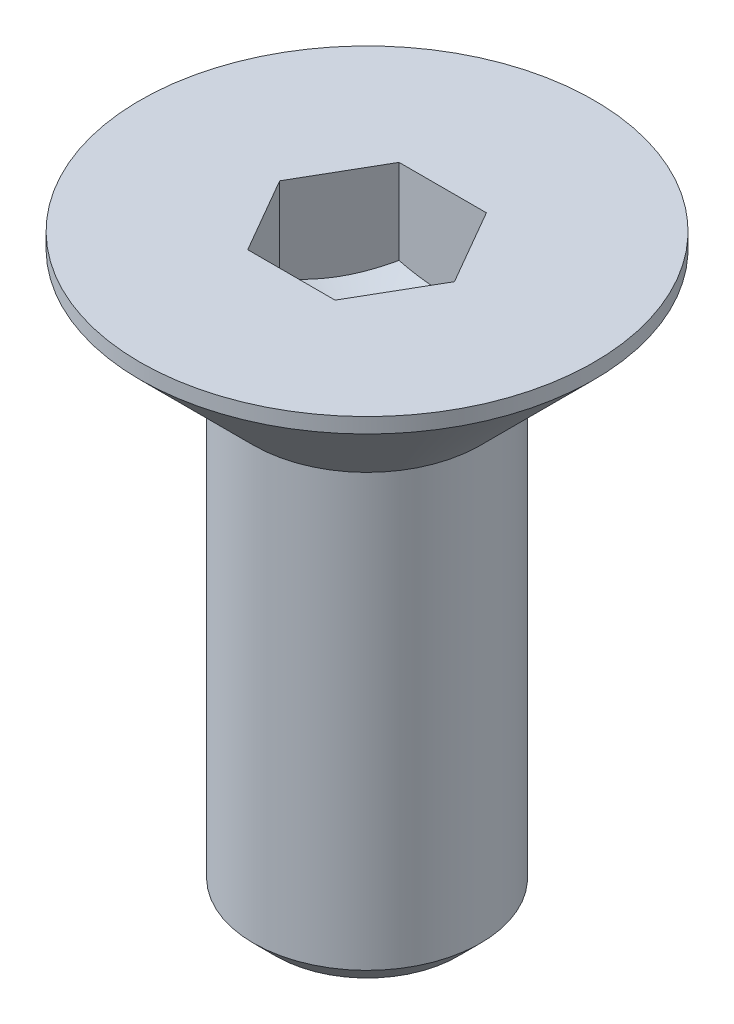
ISO-10303-21;
HEADER;
FILE_DESCRIPTION(('STEP AP214'),'2;1');
FILE_NAME('part.step','',(''),(''),'','','');
FILE_SCHEMA(('AUTOMOTIVE_DESIGN { 1 0 10303 214 1 1 1 1 }'));
ENDSEC;
DATA;
#1=APPLICATION_CONTEXT('core data for automotive mechanical design processes');
#2=APPLICATION_PROTOCOL_DEFINITION('international standard','automotive_design',2000,#1);
#3=PRODUCT_CONTEXT('',#1,'mechanical');
#4=PRODUCT('Part','Part','',(#3));
#5=PRODUCT_RELATED_PRODUCT_CATEGORY('part','',(#4));
#6=PRODUCT_DEFINITION_FORMATION('','',#4);
#7=PRODUCT_DEFINITION_CONTEXT('part definition',#1,'design');
#8=PRODUCT_DEFINITION('design','',#6,#7);
#9=PRODUCT_DEFINITION_SHAPE('','',#8);
#10=(LENGTH_UNIT() NAMED_UNIT(*) SI_UNIT(.MILLI.,.METRE.));
#11=(NAMED_UNIT(*) PLANE_ANGLE_UNIT() SI_UNIT($,.RADIAN.));
#12=(NAMED_UNIT(*) SI_UNIT($,.STERADIAN.) SOLID_ANGLE_UNIT());
#13=UNCERTAINTY_MEASURE_WITH_UNIT(LENGTH_MEASURE(1.E-05),#10,'distance_accuracy_value','');
#14=(GEOMETRIC_REPRESENTATION_CONTEXT(3) GLOBAL_UNCERTAINTY_ASSIGNED_CONTEXT((#13)) GLOBAL_UNIT_ASSIGNED_CONTEXT((#10,
#11,#12)) REPRESENTATION_CONTEXT('',''));
#15=CARTESIAN_POINT('',(0.,0.,0.));
#16=DIRECTION('',(0.,0.,1.));
#17=DIRECTION('',(1.,0.,0.));
#18=AXIS2_PLACEMENT_3D('',#15,#16,#17);
#19=CARTESIAN_POINT('',(0.,-0.200000000000006,0.));
#20=DIRECTION('',(0.,1.,0.));
#21=DIRECTION('',(0.,0.,1.));
#22=AXIS2_PLACEMENT_3D('',#19,#20,#21);
#23=CONICAL_SURFACE('',#22,3.,0.78539816339745);
#24=CARTESIAN_POINT('',(0.,-1.7,0.));
#25=DIRECTION('',(0.,1.,0.));
#26=DIRECTION('',(0.,0.,1.));
#27=AXIS2_PLACEMENT_3D('',#24,#25,#26);
#28=CIRCLE('',#27,1.5);
#29=CARTESIAN_POINT('',(0.,-1.7,1.5));
#30=VERTEX_POINT('',#29);
#31=EDGE_CURVE('E140',#30,#30,#28,.T.);
#32=ORIENTED_EDGE('',*,*,#31,.T.);
#33=EDGE_LOOP('',(#32));
#34=FACE_BOUND('',#33,.T.);
#35=CARTESIAN_POINT('',(0.,-0.200000000000006,0.));
#36=DIRECTION('',(0.,1.,0.));
#37=DIRECTION('',(0.,0.,1.));
#38=AXIS2_PLACEMENT_3D('',#35,#36,#37);
#39=CIRCLE('',#38,3.);
#40=CARTESIAN_POINT('',(0.,-0.200000000000006,3.));
#41=VERTEX_POINT('',#40);
#42=EDGE_CURVE('E11',#41,#41,#39,.T.);
#43=ORIENTED_EDGE('',*,*,#42,.F.);
#44=EDGE_LOOP('',(#43));
#45=FACE_BOUND('',#44,.T.);
#46=ADVANCED_FACE('F43',(#34,#45),#23,.T.);
#47=CARTESIAN_POINT('',(0.,2.75,0.));
#48=DIRECTION('',(0.,1.,0.));
#49=DIRECTION('',(0.,0.,1.));
#50=AXIS2_PLACEMENT_3D('',#47,#48,#49);
#51=CYLINDRICAL_SURFACE('',#50,3.);
#52=ORIENTED_EDGE('',*,*,#42,.T.);
#53=EDGE_LOOP('',(#52));
#54=FACE_BOUND('',#53,.T.);
#55=CARTESIAN_POINT('',(0.,0.,0.));
#56=DIRECTION('',(0.,1.,0.));
#57=DIRECTION('',(0.,0.,1.));
#58=AXIS2_PLACEMENT_3D('',#55,#56,#57);
#59=CIRCLE('',#58,3.);
#60=CARTESIAN_POINT('',(0.,0.,3.));
#61=VERTEX_POINT('',#60);
#62=EDGE_CURVE('E50',#61,#61,#59,.T.);
#63=ORIENTED_EDGE('',*,*,#62,.F.);
#64=EDGE_LOOP('',(#63));
#65=FACE_BOUND('',#64,.T.);
#66=ADVANCED_FACE('F207',(#54,#65),#51,.T.);
#67=CARTESIAN_POINT('',(-3.,0.,0.));
#68=DIRECTION('',(0.,1.,0.));
#69=DIRECTION('',(0.,0.,1.));
#70=AXIS2_PLACEMENT_3D('',#67,#68,#69);
#71=PLANE('',#70);
#72=DIRECTION('',(-1.,0.,0.));
#73=VECTOR('',#72,1.);
#74=CARTESIAN_POINT('',(0.577350269189625,0.,-1.));
#75=LINE('',#74,#73);
#76=CARTESIAN_POINT('',(0.577350269189625,0.,-1.));
#77=VERTEX_POINT('',#76);
#78=CARTESIAN_POINT('',(-0.577350269189626,0.,-1.));
#79=VERTEX_POINT('',#78);
#80=EDGE_CURVE('E129',#77,#79,#75,.T.);
#81=ORIENTED_EDGE('',*,*,#80,.F.);
#82=DIRECTION('',(-0.5,0.,-0.866025403784438));
#83=VECTOR('',#82,1.);
#84=CARTESIAN_POINT('',(1.15470053837925,0.,0.));
#85=LINE('',#84,#83);
#86=CARTESIAN_POINT('',(1.15470053837925,0.,0.));
#87=VERTEX_POINT('',#86);
#88=EDGE_CURVE('E329',#87,#77,#85,.T.);
#89=ORIENTED_EDGE('',*,*,#88,.F.);
#90=DIRECTION('',(0.5,0.,-0.866025403784439));
#91=VECTOR('',#90,1.);
#92=CARTESIAN_POINT('',(0.577350269189625,0.,1.));
#93=LINE('',#92,#91);
#94=CARTESIAN_POINT('',(0.577350269189625,0.,1.));
#95=VERTEX_POINT('',#94);
#96=EDGE_CURVE('E117',#95,#87,#93,.T.);
#97=ORIENTED_EDGE('',*,*,#96,.F.);
#98=DIRECTION('',(1.,0.,0.));
#99=VECTOR('',#98,1.);
#100=CARTESIAN_POINT('',(-0.577350269189626,0.,0.999999999999999));
#101=LINE('',#100,#99);
#102=CARTESIAN_POINT('',(-0.577350269189626,0.,0.999999999999999));
#103=VERTEX_POINT('',#102);
#104=EDGE_CURVE('E110',#103,#95,#101,.T.);
#105=ORIENTED_EDGE('',*,*,#104,.F.);
#106=DIRECTION('',(0.5,0.,0.866025403784439));
#107=VECTOR('',#106,1.);
#108=CARTESIAN_POINT('',(-1.15470053837925,0.,0.));
#109=LINE('',#108,#107);
#110=CARTESIAN_POINT('',(-1.15470053837925,0.,0.));
#111=VERTEX_POINT('',#110);
#112=EDGE_CURVE('E101',#111,#103,#109,.T.);
#113=ORIENTED_EDGE('',*,*,#112,.F.);
#114=DIRECTION('',(-0.5,0.,0.866025403784439));
#115=VECTOR('',#114,1.);
#116=CARTESIAN_POINT('',(-0.577350269189626,0.,-1.));
#117=LINE('',#116,#115);
#118=EDGE_CURVE('E125',#79,#111,#117,.T.);
#119=ORIENTED_EDGE('',*,*,#118,.F.);
#120=EDGE_LOOP('',(#81,#89,#97,#105,#113,#119));
#121=FACE_BOUND('',#120,.T.);
#122=ORIENTED_EDGE('',*,*,#62,.T.);
#123=EDGE_LOOP('',(#122));
#124=FACE_BOUND('',#123,.T.);
#125=ADVANCED_FACE('F114',(#121,#124),#71,.T.);
#126=CARTESIAN_POINT('',(-1.2,-7.7,0.));
#127=DIRECTION('',(0.,-1.,0.));
#128=DIRECTION('',(0.,0.,-1.));
#129=AXIS2_PLACEMENT_3D('',#126,#127,#128);
#130=PLANE('',#129);
#131=CARTESIAN_POINT('',(0.,-7.7,0.));
#132=DIRECTION('',(0.,1.,0.));
#133=DIRECTION('',(0.,0.,1.));
#134=AXIS2_PLACEMENT_3D('',#131,#132,#133);
#135=CIRCLE('',#134,1.2);
#136=CARTESIAN_POINT('',(0.,-7.7,1.2));
#137=VERTEX_POINT('',#136);
#138=EDGE_CURVE('E220',#137,#137,#135,.T.);
#139=ORIENTED_EDGE('',*,*,#138,.F.);
#140=EDGE_LOOP('',(#139));
#141=FACE_BOUND('',#140,.T.);
#142=ADVANCED_FACE('F150',(#141),#130,.T.);
#143=CARTESIAN_POINT('',(0.,-7.4,0.));
#144=DIRECTION('',(0.,1.,0.));
#145=DIRECTION('',(0.,0.,1.));
#146=AXIS2_PLACEMENT_3D('',#143,#144,#145);
#147=CONICAL_SURFACE('',#146,1.5,0.785398163397448);
#148=ORIENTED_EDGE('',*,*,#138,.T.);
#149=EDGE_LOOP('',(#148));
#150=FACE_BOUND('',#149,.T.);
#151=CARTESIAN_POINT('',(0.,-7.4,0.));
#152=DIRECTION('',(0.,1.,0.));
#153=DIRECTION('',(0.,0.,1.));
#154=AXIS2_PLACEMENT_3D('',#151,#152,#153);
#155=CIRCLE('',#154,1.5);
#156=CARTESIAN_POINT('',(0.,-7.4,1.5));
#157=VERTEX_POINT('',#156);
#158=EDGE_CURVE('E222',#157,#157,#155,.T.);
#159=ORIENTED_EDGE('',*,*,#158,.F.);
#160=EDGE_LOOP('',(#159));
#161=FACE_BOUND('',#160,.T.);
#162=ADVANCED_FACE('F230',(#150,#161),#147,.T.);
#163=CARTESIAN_POINT('',(0.,2.75,0.));
#164=DIRECTION('',(0.,1.,0.));
#165=DIRECTION('',(0.,0.,1.));
#166=AXIS2_PLACEMENT_3D('',#163,#164,#165);
#167=CYLINDRICAL_SURFACE('',#166,1.5);
#168=ORIENTED_EDGE('',*,*,#158,.T.);
#169=EDGE_LOOP('',(#168));
#170=FACE_BOUND('',#169,.T.);
#171=ORIENTED_EDGE('',*,*,#31,.F.);
#172=EDGE_LOOP('',(#171));
#173=FACE_BOUND('',#172,.T.);
#174=ADVANCED_FACE('F227',(#170,#173),#167,.T.);
#175=CARTESIAN_POINT('',(-1.15470053837925,-7.701,0.));
#176=DIRECTION('',(-0.866025403784439,0.,0.5));
#177=DIRECTION('',(0.5,0.,0.866025403784439));
#178=AXIS2_PLACEMENT_3D('',#175,#176,#177);
#179=PLANE('',#178);
#180=CARTESIAN_POINT('',(-0.577234799135788,-1.12259198712407,1.0002));
#181=CARTESIAN_POINT('',(-0.609764590185166,-1.13889705939493,0.943856749142876));
#182=CARTESIAN_POINT('',(-0.642594171837775,-1.15323329260857,0.886994245729327));
#183=CARTESIAN_POINT('',(-0.708756967764556,-1.17675162538616,0.77239692161333));
#184=CARTESIAN_POINT('',(-0.742090888846905,-1.18592563619374,0.714660876683211));
#185=CARTESIAN_POINT('',(-0.808300501957621,-1.19770852815427,0.599982462825973));
#186=CARTESIAN_POINT('',(-0.841169318434548,-1.20046229553339,0.543052002703278));
#187=CARTESIAN_POINT('',(-0.906845938134004,-1.19941028212791,0.42929676051444));
#188=CARTESIAN_POINT('',(-0.939653768818846,-1.19561164223247,0.372471930882178));
#189=CARTESIAN_POINT('',(-0.987597985475943,-1.18565282080823,0.289430111702995));
#190=CARTESIAN_POINT('',(-1.00286673286394,-1.18181792716657,0.262983865459043));
#191=CARTESIAN_POINT('',(-1.03331996349044,-1.17295547590162,0.210237322759336));
#192=CARTESIAN_POINT('',(-1.04850443749815,-1.16792779016651,0.183937042291778));
#193=CARTESIAN_POINT('',(-1.07894267805526,-1.15674053645181,0.131216463153852));
#194=CARTESIAN_POINT('',(-1.09419532601372,-1.15056896005849,0.104798101939843));
#195=CARTESIAN_POINT('',(-1.12458859422847,-1.137266878232,0.0521554171838248));
#196=CARTESIAN_POINT('',(-1.13972926353516,-1.13013682255557,0.0259310086840432));
#197=CARTESIAN_POINT('',(-1.15481600843309,-1.12259198712407,-0.000200000000000354));
#198=B_SPLINE_CURVE_WITH_KNOTS('',3,(#180,#181,#182,#183,#184,#185,#186,#187,#188,#189,#190,
#191,#192,#193,#194,#195,#196,#197),.UNSPECIFIED.,.F.,.F.,(4,2,2,2,2,2,2,2,4),(0.,
0.201343057844231,0.403000730558236,0.600061583093137,0.796907812094921,0.889221276915851,
0.981544661156804,1.07489862644294,1.16820893824305),.UNSPECIFIED.);
#199=CARTESIAN_POINT('',(-0.577350269189626,-1.12264973081037,0.999999999999999));
#200=VERTEX_POINT('',#199);
#201=CARTESIAN_POINT('',(-1.15470053837925,-1.12264973081037,0.));
#202=VERTEX_POINT('',#201);
#203=EDGE_CURVE('E76',#200,#202,#198,.T.);
#204=ORIENTED_EDGE('',*,*,#203,.T.);
#205=DIRECTION('',(0.,1.,0.));
#206=VECTOR('',#205,1.);
#207=CARTESIAN_POINT('',(-1.15470053837925,-7.701,0.));
#208=LINE('',#207,#206);
#209=EDGE_CURVE('E107',#202,#111,#208,.T.);
#210=ORIENTED_EDGE('',*,*,#209,.T.);
#211=ORIENTED_EDGE('',*,*,#112,.T.);
#212=DIRECTION('',(0.,1.,0.));
#213=VECTOR('',#212,1.);
#214=CARTESIAN_POINT('',(-0.577350269189626,-7.701,0.999999999999999));
#215=LINE('',#214,#213);
#216=EDGE_CURVE('E105',#200,#103,#215,.T.);
#217=ORIENTED_EDGE('',*,*,#216,.F.);
#218=EDGE_LOOP('',(#204,#210,#211,#217));
#219=FACE_BOUND('',#218,.T.);
#220=ADVANCED_FACE('F103',(#219),#179,.F.);
#221=CARTESIAN_POINT('',(-0.577350269189626,-7.701,-1.));
#222=DIRECTION('',(-0.866025403784439,0.,-0.5));
#223=DIRECTION('',(-0.5,0.,0.866025403784439));
#224=AXIS2_PLACEMENT_3D('',#221,#222,#223);
#225=PLANE('',#224);
#226=CARTESIAN_POINT('',(-1.15481600843309,-1.12259198712407,0.0002));
#227=CARTESIAN_POINT('',(-1.12228621738371,-1.13889705939493,-0.0561432508571231));
#228=CARTESIAN_POINT('',(-1.0894566357311,-1.15323329260857,-0.113005754270672));
#229=CARTESIAN_POINT('',(-1.02329383980432,-1.17675162538616,-0.227603078386669));
#230=CARTESIAN_POINT('',(-0.989959918721971,-1.18592563619374,-0.285339123316788));
#231=CARTESIAN_POINT('',(-0.923750305611256,-1.19770852815427,-0.400017537174026));
#232=CARTESIAN_POINT('',(-0.890881489134329,-1.20046229553339,-0.456947997296721));
#233=CARTESIAN_POINT('',(-0.825204869434872,-1.19941028212791,-0.570703239485559));
#234=CARTESIAN_POINT('',(-0.792397038750031,-1.19561164223247,-0.627528069117821));
#235=CARTESIAN_POINT('',(-0.744452822092934,-1.18565282080823,-0.710569888297004));
#236=CARTESIAN_POINT('',(-0.729184074704933,-1.18181792716657,-0.737016134540956));
#237=CARTESIAN_POINT('',(-0.698730844078435,-1.17295547590162,-0.789762677240663));
#238=CARTESIAN_POINT('',(-0.683546370070727,-1.16792779016651,-0.816062957708222));
#239=CARTESIAN_POINT('',(-0.653108129513613,-1.15674053645181,-0.868783536846147));
#240=CARTESIAN_POINT('',(-0.637855481555156,-1.15056896005849,-0.895201898060156));
#241=CARTESIAN_POINT('',(-0.607462213340404,-1.137266878232,-0.947844582816175));
#242=CARTESIAN_POINT('',(-0.592321544033717,-1.13013682255557,-0.974068991315956));
#243=CARTESIAN_POINT('',(-0.577234799135788,-1.12259198712407,-1.0002));
#244=B_SPLINE_CURVE_WITH_KNOTS('',3,(#226,#227,#228,#229,#230,#231,#232,#233,#234,#235,#236,
#237,#238,#239,#240,#241,#242,#243),.UNSPECIFIED.,.F.,.F.,(4,2,2,2,2,2,2,2,4),(0.,
0.201343057844231,0.403000730558236,0.600061583093137,0.79690781209492,0.889221276915851,
0.981544661156804,1.07489862644294,1.16820893824305),.UNSPECIFIED.);
#245=CARTESIAN_POINT('',(-0.577350269189626,-1.12264973081037,-1.));
#246=VERTEX_POINT('',#245);
#247=EDGE_CURVE('E72',#202,#246,#244,.T.);
#248=ORIENTED_EDGE('',*,*,#247,.T.);
#249=DIRECTION('',(0.,1.,0.));
#250=VECTOR('',#249,1.);
#251=CARTESIAN_POINT('',(-0.577350269189626,-7.701,-1.));
#252=LINE('',#251,#250);
#253=EDGE_CURVE('E320',#246,#79,#252,.T.);
#254=ORIENTED_EDGE('',*,*,#253,.T.);
#255=ORIENTED_EDGE('',*,*,#118,.T.);
#256=ORIENTED_EDGE('',*,*,#209,.F.);
#257=EDGE_LOOP('',(#248,#254,#255,#256));
#258=FACE_BOUND('',#257,.T.);
#259=ADVANCED_FACE('F187',(#258),#225,.F.);
#260=CARTESIAN_POINT('',(0.577350269189625,-7.701,-1.));
#261=DIRECTION('',(0.,0.,-1.));
#262=DIRECTION('',(-1.,0.,0.));
#263=AXIS2_PLACEMENT_3D('',#260,#261,#262);
#264=PLANE('',#263);
#265=CARTESIAN_POINT('',(-2.63262528809607,-0.291923660847633,-0.999999999999999));
#266=CARTESIAN_POINT('',(-2.56429064656454,-0.323862949371669,-0.999999999999999));
#267=CARTESIAN_POINT('',(-2.49589766845585,-0.355676587272023,-0.999999999999999));
#268=CARTESIAN_POINT('',(-2.35896008258613,-0.41898325462824,-0.999999999999999));
#269=CARTESIAN_POINT('',(-2.2904154685981,-0.450476270608533,-1.));
#270=CARTESIAN_POINT('',(-2.08430214636791,-0.544461341333556,-1.));
#271=CARTESIAN_POINT('',(-1.94646103375349,-0.606362110821685,-1.));
#272=CARTESIAN_POINT('',(-1.73371549581794,-0.699437847391007,-1.));
#273=CARTESIAN_POINT('',(-1.6592287526792,-0.73156575837657,-1.));
#274=CARTESIAN_POINT('',(-1.50980335852628,-0.794750402076873,-1.));
#275=CARTESIAN_POINT('',(-1.43486472299223,-0.825807171242729,-1.));
#276=CARTESIAN_POINT('',(-1.28440526412874,-0.886411054898249,-1.));
#277=CARTESIAN_POINT('',(-1.20888464969575,-0.915958684460773,-1.));
#278=CARTESIAN_POINT('',(-1.05703533716091,-0.972883366544078,-1.));
#279=CARTESIAN_POINT('',(-0.980706765313584,-1.00026075268131,-1.));
#280=CARTESIAN_POINT('',(-0.823177172398949,-1.05307775103719,-1.));
#281=CARTESIAN_POINT('',(-0.741920972964493,-1.07835613718313,-1.));
#282=CARTESIAN_POINT('',(-0.577895051188724,-1.12352926751169,-1.));
#283=CARTESIAN_POINT('',(-0.495125597652283,-1.14342495811109,-1.));
#284=CARTESIAN_POINT('',(-0.330006289761957,-1.17481309753832,-1.));
#285=CARTESIAN_POINT('',(-0.247695969196873,-1.18649975201415,-1.));
#286=CARTESIAN_POINT('',(-0.123674317237458,-1.19660748887593,-1.));
#287=CARTESIAN_POINT('',(-0.0822549283276812,-1.19874021658886,-1.));
#288=CARTESIAN_POINT('',(0.000639212818301256,-1.20042748916219,-1.));
#289=CARTESIAN_POINT('',(0.0421139641647932,-1.19998207496815,-1.));
#290=CARTESIAN_POINT('',(0.125126750688167,-1.19652783891943,-1.));
#291=CARTESIAN_POINT('',(0.166664334145483,-1.19350838615173,-1.));
#292=CARTESIAN_POINT('',(0.249499213665388,-1.18507200154941,-1.));
#293=CARTESIAN_POINT('',(0.29079645237857,-1.17965451950773,-1.));
#294=CARTESIAN_POINT('',(0.414271053215846,-1.16020487892201,-1.));
#295=CARTESIAN_POINT('',(0.495946187677521,-1.14298006945516,-1.));
#296=CARTESIAN_POINT('',(0.659774977265158,-1.10206467230054,-1.));
#297=CARTESIAN_POINT('',(0.741888417990827,-1.0782214622834,-1.));
#298=CARTESIAN_POINT('',(0.904753187185896,-1.02645728769622,-1.));
#299=CARTESIAN_POINT('',(0.985505119474069,-0.998538186807387,-1.));
#300=CARTESIAN_POINT('',(1.13467252491979,-0.944144923962191,-1.));
#301=CARTESIAN_POINT('',(1.20321887285992,-0.918024015538437,-1.));
#302=CARTESIAN_POINT('',(1.33975536614078,-0.864360611365441,-1.));
#303=CARTESIAN_POINT('',(1.407745475269,-0.836818023901272,-1.));
#304=CARTESIAN_POINT('',(1.61112993864106,-0.752650596664789,-1.));
#305=CARTESIAN_POINT('',(1.74589171882516,-0.694503804574701,-1.));
#306=CARTESIAN_POINT('',(2.00631885845381,-0.579522270331049,-1.));
#307=CARTESIAN_POINT('',(2.1320432385404,-0.522819430071231,-1.));
#308=CARTESIAN_POINT('',(2.32013036861752,-0.436832655301074,-1.));
#309=CARTESIAN_POINT('',(2.38271299357799,-0.408028991914031,-1.));
#310=CARTESIAN_POINT('',(2.50775504398938,-0.350159242168671,-1.));
#311=CARTESIAN_POINT('',(2.57021447232152,-0.321093162038353,-1.));
#312=CARTESIAN_POINT('',(2.63262528809607,-0.291923660847632,-1.));
#313=B_SPLINE_CURVE_WITH_KNOTS('',3,(#265,#266,#267,#268,#269,#270,#271,#272,#273,#274,#275,
#276,#277,#278,#279,#280,#281,#282,#283,#284,#285,#286,#287,#288,#289,#290,#291,#292,#293,#294,
#295,#296,#297,#298,#299,#300,#301,#302,#303,#304,#305,#306,#307,#308,#309,#310,#311,#312),
.UNSPECIFIED.,.F.,.F.,(4,2,2,2,2,2,2,2,2,2,2,2,2,2,2,2,2,2,2,2,2,2,2,4),(0.,0.226290096412117,
0.452589664735988,0.90587518051611,1.14922992383269,1.39257637756409,1.63583921383995,
1.87906458219844,2.13423650580702,2.38936353440514,2.63823072439062,2.76258169729924,
2.88693069529553,3.01179576312409,3.13668949502312,3.38673127450417,3.6431019524082,
3.8993557711058,4.11940095343747,4.33946034904208,4.77972893108907,5.19348088804898,
5.4001590471648,5.60683231396586),.UNSPECIFIED.);
#314=CARTESIAN_POINT('',(0.577350269189625,-1.12264973081037,-1.));
#315=VERTEX_POINT('',#314);
#316=EDGE_CURVE('E171',#246,#315,#313,.T.);
#317=ORIENTED_EDGE('',*,*,#316,.T.);
#318=DIRECTION('',(0.,1.,0.));
#319=VECTOR('',#318,1.);
#320=CARTESIAN_POINT('',(0.577350269189625,-7.701,-1.));
#321=LINE('',#320,#319);
#322=EDGE_CURVE('E323',#315,#77,#321,.T.);
#323=ORIENTED_EDGE('',*,*,#322,.T.);
#324=ORIENTED_EDGE('',*,*,#80,.T.);
#325=ORIENTED_EDGE('',*,*,#253,.F.);
#326=EDGE_LOOP('',(#317,#323,#324,#325));
#327=FACE_BOUND('',#326,.T.);
#328=ADVANCED_FACE('F190',(#327),#264,.F.);
#329=CARTESIAN_POINT('',(1.15470053837925,-7.701,0.));
#330=DIRECTION('',(0.866025403784439,0.,-0.5));
#331=DIRECTION('',(-0.5,0.,-0.866025403784439));
#332=AXIS2_PLACEMENT_3D('',#329,#330,#331);
#333=PLANE('',#332);
#334=CARTESIAN_POINT('',(0.577234799135787,-1.12259198712407,-1.0002));
#335=CARTESIAN_POINT('',(0.609764590185166,-1.13889705939493,-0.943856749142877));
#336=CARTESIAN_POINT('',(0.642594171837774,-1.15323329260857,-0.886994245729328));
#337=CARTESIAN_POINT('',(0.708756967764556,-1.17675162538616,-0.772396921613331));
#338=CARTESIAN_POINT('',(0.742090888846904,-1.18592563619374,-0.714660876683212));
#339=CARTESIAN_POINT('',(0.80830050195762,-1.19770852815427,-0.599982462825974));
#340=CARTESIAN_POINT('',(0.841169318434547,-1.20046229553339,-0.543052002703279));
#341=CARTESIAN_POINT('',(0.906845938134004,-1.19941028212791,-0.429296760514441));
#342=CARTESIAN_POINT('',(0.939653768818845,-1.19561164223247,-0.372471930882179));
#343=CARTESIAN_POINT('',(0.987597985475943,-1.18565282080823,-0.289430111702996));
#344=CARTESIAN_POINT('',(1.00286673286394,-1.18181792716657,-0.262983865459044));
#345=CARTESIAN_POINT('',(1.03331996349044,-1.17295547590162,-0.210237322759337));
#346=CARTESIAN_POINT('',(1.04850443749815,-1.16792779016651,-0.183937042291779));
#347=CARTESIAN_POINT('',(1.07894267805526,-1.15674053645181,-0.131216463153853));
#348=CARTESIAN_POINT('',(1.09419532601372,-1.15056896005849,-0.104798101939844));
#349=CARTESIAN_POINT('',(1.12458859422847,-1.137266878232,-0.0521554171838256));
#350=CARTESIAN_POINT('',(1.13972926353516,-1.13013682255557,-0.0259310086840439));
#351=CARTESIAN_POINT('',(1.15481600843309,-1.12259198712407,0.000199999999999693));
#352=B_SPLINE_CURVE_WITH_KNOTS('',3,(#334,#335,#336,#337,#338,#339,#340,#341,#342,#343,#344,
#345,#346,#347,#348,#349,#350,#351),.UNSPECIFIED.,.F.,.F.,(4,2,2,2,2,2,2,2,4),(0.,
0.201343057844231,0.403000730558236,0.600061583093137,0.796907812094921,0.889221276915851,
0.981544661156804,1.07489862644294,1.16820893824305),.UNSPECIFIED.);
#353=CARTESIAN_POINT('',(1.15470053837925,-1.12264973081037,0.));
#354=VERTEX_POINT('',#353);
#355=EDGE_CURVE('E164',#315,#354,#352,.T.);
#356=ORIENTED_EDGE('',*,*,#355,.T.);
#357=DIRECTION('',(0.,1.,0.));
#358=VECTOR('',#357,1.);
#359=CARTESIAN_POINT('',(1.15470053837925,-7.701,0.));
#360=LINE('',#359,#358);
#361=EDGE_CURVE('E127',#354,#87,#360,.T.);
#362=ORIENTED_EDGE('',*,*,#361,.T.);
#363=ORIENTED_EDGE('',*,*,#88,.T.);
#364=ORIENTED_EDGE('',*,*,#322,.F.);
#365=EDGE_LOOP('',(#356,#362,#363,#364));
#366=FACE_BOUND('',#365,.T.);
#367=ADVANCED_FACE('F194',(#366),#333,.F.);
#368=CARTESIAN_POINT('',(0.577350269189625,-7.701,1.));
#369=DIRECTION('',(0.866025403784439,0.,0.5));
#370=DIRECTION('',(0.5,0.,-0.866025403784439));
#371=AXIS2_PLACEMENT_3D('',#368,#369,#370);
#372=PLANE('',#371);
#373=CARTESIAN_POINT('',(1.15481600843309,-1.12259198712407,-0.000200000000000651));
#374=CARTESIAN_POINT('',(1.12228621738371,-1.13889705939493,0.0561432508571225));
#375=CARTESIAN_POINT('',(1.0894566357311,-1.15323329260857,0.113005754270671));
#376=CARTESIAN_POINT('',(1.02329383980432,-1.17675162538616,0.227603078386668));
#377=CARTESIAN_POINT('',(0.989959918721971,-1.18592563619374,0.285339123316788));
#378=CARTESIAN_POINT('',(0.923750305611256,-1.19770852815427,0.400017537174026));
#379=CARTESIAN_POINT('',(0.890881489134328,-1.20046229553339,0.456947997296721));
#380=CARTESIAN_POINT('',(0.825204869434872,-1.19941028212791,0.570703239485559));
#381=CARTESIAN_POINT('',(0.792397038750031,-1.19561164223247,0.627528069117821));
#382=CARTESIAN_POINT('',(0.744452822092934,-1.18565282080823,0.710569888297003));
#383=CARTESIAN_POINT('',(0.729184074704933,-1.18181792716657,0.737016134540956));
#384=CARTESIAN_POINT('',(0.698730844078435,-1.17295547590162,0.789762677240663));
#385=CARTESIAN_POINT('',(0.683546370070727,-1.16792779016651,0.816062957708221));
#386=CARTESIAN_POINT('',(0.653108129513613,-1.15674053645181,0.868783536846147));
#387=CARTESIAN_POINT('',(0.637855481555156,-1.15056896005849,0.895201898060156));
#388=CARTESIAN_POINT('',(0.607462213340404,-1.137266878232,0.947844582816174));
#389=CARTESIAN_POINT('',(0.592321544033716,-1.13013682255557,0.974068991315956));
#390=CARTESIAN_POINT('',(0.577234799135787,-1.12259198712407,1.0002));
#391=B_SPLINE_CURVE_WITH_KNOTS('',3,(#373,#374,#375,#376,#377,#378,#379,#380,#381,#382,#383,
#384,#385,#386,#387,#388,#389,#390),.UNSPECIFIED.,.F.,.F.,(4,2,2,2,2,2,2,2,4),(0.,
0.201343057844231,0.403000730558236,0.600061583093137,0.796907812094921,0.889221276915852,
0.981544661156804,1.07489862644294,1.16820893824305),.UNSPECIFIED.);
#392=CARTESIAN_POINT('',(0.577350269189625,-1.12264973081037,1.));
#393=VERTEX_POINT('',#392);
#394=EDGE_CURVE('E61',#354,#393,#391,.T.);
#395=ORIENTED_EDGE('',*,*,#394,.T.);
#396=DIRECTION('',(0.,1.,0.));
#397=VECTOR('',#396,1.);
#398=CARTESIAN_POINT('',(0.577350269189625,-7.701,1.));
#399=LINE('',#398,#397);
#400=EDGE_CURVE('E124',#393,#95,#399,.T.);
#401=ORIENTED_EDGE('',*,*,#400,.T.);
#402=ORIENTED_EDGE('',*,*,#96,.T.);
#403=ORIENTED_EDGE('',*,*,#361,.F.);
#404=EDGE_LOOP('',(#395,#401,#402,#403));
#405=FACE_BOUND('',#404,.T.);
#406=ADVANCED_FACE('F198',(#405),#372,.F.);
#407=CARTESIAN_POINT('',(-0.577350269189626,-7.701,0.999999999999999));
#408=DIRECTION('',(0.,0.,1.));
#409=DIRECTION('',(1.,0.,0.));
#410=AXIS2_PLACEMENT_3D('',#407,#408,#409);
#411=PLANE('',#410);
#412=CARTESIAN_POINT('',(2.63262528809607,-0.291923660847632,1.));
#413=CARTESIAN_POINT('',(2.56429064656454,-0.323862949371669,1.));
#414=CARTESIAN_POINT('',(2.49589766845585,-0.355676587272023,1.));
#415=CARTESIAN_POINT('',(2.35896008258613,-0.41898325462824,1.));
#416=CARTESIAN_POINT('',(2.2904154685981,-0.450476270608533,1.));
#417=CARTESIAN_POINT('',(2.08430214636791,-0.544461341333556,1.));
#418=CARTESIAN_POINT('',(1.94646103375349,-0.606362110821685,1.));
#419=CARTESIAN_POINT('',(1.73371549581794,-0.699437847391007,1.));
#420=CARTESIAN_POINT('',(1.6592287526792,-0.73156575837657,1.));
#421=CARTESIAN_POINT('',(1.50980335852628,-0.794750402076873,1.));
#422=CARTESIAN_POINT('',(1.43486472299223,-0.825807171242728,1.));
#423=CARTESIAN_POINT('',(1.28440526412874,-0.886411054898249,1.));
#424=CARTESIAN_POINT('',(1.20888464969575,-0.915958684460773,1.));
#425=CARTESIAN_POINT('',(1.05703533716091,-0.972883366544078,1.));
#426=CARTESIAN_POINT('',(0.980706765313584,-1.00026075268131,1.));
#427=CARTESIAN_POINT('',(0.823177172398948,-1.05307775103719,1.));
#428=CARTESIAN_POINT('',(0.741920972964492,-1.07835613718313,1.));
#429=CARTESIAN_POINT('',(0.577895051188723,-1.12352926751169,1.));
#430=CARTESIAN_POINT('',(0.495125597652283,-1.14342495811109,1.));
#431=CARTESIAN_POINT('',(0.330006289761957,-1.17481309753832,1.));
#432=CARTESIAN_POINT('',(0.247695969196872,-1.18649975201415,1.));
#433=CARTESIAN_POINT('',(0.123674317237458,-1.19660748887593,1.));
#434=CARTESIAN_POINT('',(0.0822549283276814,-1.19874021658886,1.));
#435=CARTESIAN_POINT('',(-0.000639212818301161,-1.20042748916219,1.));
#436=CARTESIAN_POINT('',(-0.0421139641647931,-1.19998207496815,0.999999999999999));
#437=CARTESIAN_POINT('',(-0.125126750688167,-1.19652783891943,0.999999999999999));
#438=CARTESIAN_POINT('',(-0.166664334145483,-1.19350838615173,0.999999999999999));
#439=CARTESIAN_POINT('',(-0.249499213665388,-1.18507200154941,0.999999999999999));
#440=CARTESIAN_POINT('',(-0.29079645237857,-1.17965451950773,0.999999999999999));
#441=CARTESIAN_POINT('',(-0.414271053215845,-1.16020487892201,0.999999999999999));
#442=CARTESIAN_POINT('',(-0.495946187677521,-1.14298006945516,0.999999999999999));
#443=CARTESIAN_POINT('',(-0.659774977265158,-1.10206467230054,0.999999999999999));
#444=CARTESIAN_POINT('',(-0.741888417990827,-1.0782214622834,0.999999999999999));
#445=CARTESIAN_POINT('',(-0.904753187185896,-1.02645728769622,0.999999999999999));
#446=CARTESIAN_POINT('',(-0.985505119474069,-0.998538186807388,0.999999999999999));
#447=CARTESIAN_POINT('',(-1.13467252491979,-0.944144923962191,0.999999999999999));
#448=CARTESIAN_POINT('',(-1.20321887285992,-0.918024015538437,0.999999999999999));
#449=CARTESIAN_POINT('',(-1.33975536614078,-0.864360611365442,0.999999999999999));
#450=CARTESIAN_POINT('',(-1.40774547526899,-0.836818023901273,0.999999999999999));
#451=CARTESIAN_POINT('',(-1.61112993864106,-0.75265059666479,0.999999999999999));
#452=CARTESIAN_POINT('',(-1.74589171882516,-0.694503804574701,0.999999999999999));
#453=CARTESIAN_POINT('',(-2.00631885845381,-0.579522270331049,0.999999999999999));
#454=CARTESIAN_POINT('',(-2.13204323854039,-0.522819430071232,0.999999999999999));
#455=CARTESIAN_POINT('',(-2.32013036861752,-0.436832655301075,0.999999999999999));
#456=CARTESIAN_POINT('',(-2.38271299357799,-0.408028991914031,0.999999999999999));
#457=CARTESIAN_POINT('',(-2.50775504398938,-0.350159242168671,0.999999999999999));
#458=CARTESIAN_POINT('',(-2.57021447232152,-0.321093162038353,0.999999999999999));
#459=CARTESIAN_POINT('',(-2.63262528809607,-0.291923660847633,0.999999999999999));
#460=B_SPLINE_CURVE_WITH_KNOTS('',3,(#412,#413,#414,#415,#416,#417,#418,#419,#420,#421,#422,
#423,#424,#425,#426,#427,#428,#429,#430,#431,#432,#433,#434,#435,#436,#437,#438,#439,#440,#441,
#442,#443,#444,#445,#446,#447,#448,#449,#450,#451,#452,#453,#454,#455,#456,#457,#458,#459),
.UNSPECIFIED.,.F.,.F.,(4,2,2,2,2,2,2,2,2,2,2,2,2,2,2,2,2,2,2,2,2,2,2,4),(0.,0.226290096412117,
0.452589664735988,0.90587518051611,1.14922992383269,1.39257637756409,1.63583921383995,
1.87906458219844,2.13423650580702,2.38936353440514,2.63823072439062,2.76258169729924,
2.88693069529553,3.01179576312409,3.13668949502312,3.38673127450417,3.6431019524082,
3.8993557711058,4.11940095343747,4.33946034904208,4.77972893108907,5.19348088804898,
5.4001590471648,5.60683231396586),.UNSPECIFIED.);
#461=EDGE_CURVE('E123',#393,#200,#460,.T.);
#462=ORIENTED_EDGE('',*,*,#461,.T.);
#463=ORIENTED_EDGE('',*,*,#216,.T.);
#464=ORIENTED_EDGE('',*,*,#104,.T.);
#465=ORIENTED_EDGE('',*,*,#400,.F.);
#466=EDGE_LOOP('',(#462,#463,#464,#465));
#467=FACE_BOUND('',#466,.T.);
#468=ADVANCED_FACE('F122',(#467),#411,.F.);
#469=CARTESIAN_POINT('',(0.,-1.7,0.));
#470=DIRECTION('',(0.,1.,0.));
#471=DIRECTION('',(0.,0.,1.));
#472=AXIS2_PLACEMENT_3D('',#469,#470,#471);
#473=CONICAL_SURFACE('',#472,0.,1.10714871779409);
#474=ORIENTED_EDGE('',*,*,#203,.F.);
#475=ORIENTED_EDGE('',*,*,#461,.F.);
#476=ORIENTED_EDGE('',*,*,#394,.F.);
#477=ORIENTED_EDGE('',*,*,#355,.F.);
#478=ORIENTED_EDGE('',*,*,#316,.F.);
#479=ORIENTED_EDGE('',*,*,#247,.F.);
#480=EDGE_LOOP('',(#474,#475,#476,#477,#478,#479));
#481=FACE_BOUND('',#480,.T.);
#482=CARTESIAN_POINT('',(0.,-1.7,0.));
#483=VERTEX_POINT('',#482);
#484=VERTEX_LOOP('',#483);
#485=FACE_BOUND('',#484,.T.);
#486=ADVANCED_FACE('F145',(#481,#485),#473,.F.);
#487=CLOSED_SHELL('',(#46,#66,#125,#142,#162,#174,#220,#259,#328,#367,#406,#468,#486));
#488=MANIFOLD_SOLID_BREP('B2',#487);
#489=ADVANCED_BREP_SHAPE_REPRESENTATION('',(#18,#488),#14);
#490=SHAPE_DEFINITION_REPRESENTATION(#9,#489);
ENDSEC;
END-ISO-10303-21;
